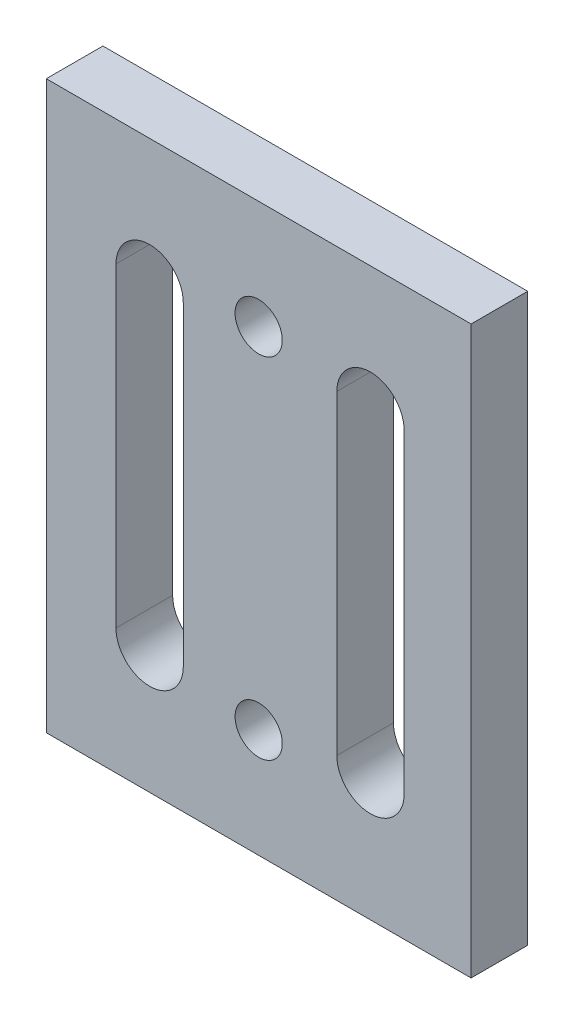
ISO-10303-21;
HEADER;
FILE_DESCRIPTION(('STEP AP214'),'2;1');
FILE_NAME('part.step','',(''),(''),'','','');
FILE_SCHEMA(('AUTOMOTIVE_DESIGN { 1 0 10303 214 1 1 1 1 }'));
ENDSEC;
DATA;
#1=APPLICATION_CONTEXT('core data for automotive mechanical design processes');
#2=APPLICATION_PROTOCOL_DEFINITION('international standard','automotive_design',2000,#1);
#3=PRODUCT_CONTEXT('',#1,'mechanical');
#4=PRODUCT('Part','Part','',(#3));
#5=PRODUCT_RELATED_PRODUCT_CATEGORY('part','',(#4));
#6=PRODUCT_DEFINITION_FORMATION('','',#4);
#7=PRODUCT_DEFINITION_CONTEXT('part definition',#1,'design');
#8=PRODUCT_DEFINITION('design','',#6,#7);
#9=PRODUCT_DEFINITION_SHAPE('','',#8);
#10=(LENGTH_UNIT() NAMED_UNIT(*) SI_UNIT(.MILLI.,.METRE.));
#11=(NAMED_UNIT(*) PLANE_ANGLE_UNIT() SI_UNIT($,.RADIAN.));
#12=(NAMED_UNIT(*) SI_UNIT($,.STERADIAN.) SOLID_ANGLE_UNIT());
#13=UNCERTAINTY_MEASURE_WITH_UNIT(LENGTH_MEASURE(1.E-05),#10,'distance_accuracy_value','');
#14=(GEOMETRIC_REPRESENTATION_CONTEXT(3) GLOBAL_UNCERTAINTY_ASSIGNED_CONTEXT((#13)) GLOBAL_UNIT_ASSIGNED_CONTEXT((#10,
#11,#12)) REPRESENTATION_CONTEXT('',''));
#15=CARTESIAN_POINT('',(0.,0.,0.));
#16=DIRECTION('',(0.,0.,1.));
#17=DIRECTION('',(1.,0.,0.));
#18=AXIS2_PLACEMENT_3D('',#15,#16,#17);
#19=CARTESIAN_POINT('',(-22.5,30.,6.));
#20=DIRECTION('',(0.,1.,0.));
#21=DIRECTION('',(0.,0.,1.));
#22=AXIS2_PLACEMENT_3D('',#19,#20,#21);
#23=PLANE('',#22);
#24=DIRECTION('',(1.,0.,0.));
#25=VECTOR('',#24,1.);
#26=CARTESIAN_POINT('',(-22.5,30.,0.));
#27=LINE('',#26,#25);
#28=CARTESIAN_POINT('',(-22.5,30.,0.));
#29=VERTEX_POINT('',#28);
#30=CARTESIAN_POINT('',(22.5,30.,0.));
#31=VERTEX_POINT('',#30);
#32=EDGE_CURVE('E204',#29,#31,#27,.T.);
#33=ORIENTED_EDGE('',*,*,#32,.F.);
#34=DIRECTION('',(0.,0.,-1.));
#35=VECTOR('',#34,1.);
#36=CARTESIAN_POINT('',(-22.5,30.,6.));
#37=LINE('',#36,#35);
#38=CARTESIAN_POINT('',(-22.5,30.,6.));
#39=VERTEX_POINT('',#38);
#40=EDGE_CURVE('E11',#39,#29,#37,.T.);
#41=ORIENTED_EDGE('',*,*,#40,.F.);
#42=DIRECTION('',(1.,0.,0.));
#43=VECTOR('',#42,1.);
#44=CARTESIAN_POINT('',(-22.5,30.,6.));
#45=LINE('',#44,#43);
#46=CARTESIAN_POINT('',(22.5,30.,6.));
#47=VERTEX_POINT('',#46);
#48=EDGE_CURVE('E207',#39,#47,#45,.T.);
#49=ORIENTED_EDGE('',*,*,#48,.T.);
#50=DIRECTION('',(0.,0.,-1.));
#51=VECTOR('',#50,1.);
#52=CARTESIAN_POINT('',(22.5,30.,6.));
#53=LINE('',#52,#51);
#54=EDGE_CURVE('E40',#47,#31,#53,.T.);
#55=ORIENTED_EDGE('',*,*,#54,.T.);
#56=EDGE_LOOP('',(#33,#41,#49,#55));
#57=FACE_BOUND('',#56,.T.);
#58=ADVANCED_FACE('F37',(#57),#23,.T.);
#59=CARTESIAN_POINT('',(-22.5,-30.,6.));
#60=DIRECTION('',(-1.,0.,0.));
#61=DIRECTION('',(0.,0.,1.));
#62=AXIS2_PLACEMENT_3D('',#59,#60,#61);
#63=PLANE('',#62);
#64=DIRECTION('',(0.,1.,0.));
#65=VECTOR('',#64,1.);
#66=CARTESIAN_POINT('',(-22.5,-30.,0.));
#67=LINE('',#66,#65);
#68=CARTESIAN_POINT('',(-22.5,-30.,0.));
#69=VERTEX_POINT('',#68);
#70=EDGE_CURVE('E211',#69,#29,#67,.T.);
#71=ORIENTED_EDGE('',*,*,#70,.F.);
#72=DIRECTION('',(0.,0.,-1.));
#73=VECTOR('',#72,1.);
#74=CARTESIAN_POINT('',(-22.5,-30.,6.));
#75=LINE('',#74,#73);
#76=CARTESIAN_POINT('',(-22.5,-30.,6.));
#77=VERTEX_POINT('',#76);
#78=EDGE_CURVE('E45',#77,#69,#75,.T.);
#79=ORIENTED_EDGE('',*,*,#78,.F.);
#80=DIRECTION('',(0.,1.,0.));
#81=VECTOR('',#80,1.);
#82=CARTESIAN_POINT('',(-22.5,-30.,6.));
#83=LINE('',#82,#81);
#84=EDGE_CURVE('E217',#77,#39,#83,.T.);
#85=ORIENTED_EDGE('',*,*,#84,.T.);
#86=ORIENTED_EDGE('',*,*,#40,.T.);
#87=EDGE_LOOP('',(#71,#79,#85,#86));
#88=FACE_BOUND('',#87,.T.);
#89=ADVANCED_FACE('F243',(#88),#63,.T.);
#90=CARTESIAN_POINT('',(22.5,-30.,6.));
#91=DIRECTION('',(0.,-1.,0.));
#92=DIRECTION('',(0.,0.,-1.));
#93=AXIS2_PLACEMENT_3D('',#90,#91,#92);
#94=PLANE('',#93);
#95=DIRECTION('',(-1.,0.,0.));
#96=VECTOR('',#95,1.);
#97=CARTESIAN_POINT('',(22.5,-30.,0.));
#98=LINE('',#97,#96);
#99=CARTESIAN_POINT('',(22.5,-30.,0.));
#100=VERTEX_POINT('',#99);
#101=EDGE_CURVE('E225',#100,#69,#98,.T.);
#102=ORIENTED_EDGE('',*,*,#101,.F.);
#103=DIRECTION('',(0.,0.,-1.));
#104=VECTOR('',#103,1.);
#105=CARTESIAN_POINT('',(22.5,-30.,6.));
#106=LINE('',#105,#104);
#107=CARTESIAN_POINT('',(22.5,-30.,6.));
#108=VERTEX_POINT('',#107);
#109=EDGE_CURVE('E230',#108,#100,#106,.T.);
#110=ORIENTED_EDGE('',*,*,#109,.F.);
#111=DIRECTION('',(-1.,0.,0.));
#112=VECTOR('',#111,1.);
#113=CARTESIAN_POINT('',(22.5,-30.,6.));
#114=LINE('',#113,#112);
#115=EDGE_CURVE('E214',#108,#77,#114,.T.);
#116=ORIENTED_EDGE('',*,*,#115,.T.);
#117=ORIENTED_EDGE('',*,*,#78,.T.);
#118=EDGE_LOOP('',(#102,#110,#116,#117));
#119=FACE_BOUND('',#118,.T.);
#120=ADVANCED_FACE('F248',(#119),#94,.T.);
#121=CARTESIAN_POINT('',(22.5,30.,6.));
#122=DIRECTION('',(1.,0.,0.));
#123=DIRECTION('',(0.,0.,-1.));
#124=AXIS2_PLACEMENT_3D('',#121,#122,#123);
#125=PLANE('',#124);
#126=DIRECTION('',(0.,-1.,0.));
#127=VECTOR('',#126,1.);
#128=CARTESIAN_POINT('',(22.5,30.,0.));
#129=LINE('',#128,#127);
#130=EDGE_CURVE('E222',#31,#100,#129,.T.);
#131=ORIENTED_EDGE('',*,*,#130,.F.);
#132=ORIENTED_EDGE('',*,*,#54,.F.);
#133=DIRECTION('',(0.,-1.,0.));
#134=VECTOR('',#133,1.);
#135=CARTESIAN_POINT('',(22.5,30.,6.));
#136=LINE('',#135,#134);
#137=EDGE_CURVE('E210',#47,#108,#136,.T.);
#138=ORIENTED_EDGE('',*,*,#137,.T.);
#139=ORIENTED_EDGE('',*,*,#109,.T.);
#140=EDGE_LOOP('',(#131,#132,#138,#139));
#141=FACE_BOUND('',#140,.T.);
#142=ADVANCED_FACE('F238',(#141),#125,.T.);
#143=CARTESIAN_POINT('',(0.,0.,6.));
#144=DIRECTION('',(0.,0.,-1.));
#145=DIRECTION('',(-1.,0.,0.));
#146=AXIS2_PLACEMENT_3D('',#143,#144,#145);
#147=PLANE('',#146);
#148=DIRECTION('',(0.,1.,0.));
#149=VECTOR('',#148,1.);
#150=CARTESIAN_POINT('',(-15.1153246739558,16.7000000000324,6.));
#151=LINE('',#150,#149);
#152=CARTESIAN_POINT('',(-15.1153246739558,-16.7,6.));
#153=VERTEX_POINT('',#152);
#154=CARTESIAN_POINT('',(-15.1153246739558,16.7000000000324,6.));
#155=VERTEX_POINT('',#154);
#156=EDGE_CURVE('E134',#153,#155,#151,.T.);
#157=ORIENTED_EDGE('',*,*,#156,.T.);
#158=CARTESIAN_POINT('',(-11.5513733386219,16.7000000000324,6.));
#159=DIRECTION('',(0.,0.,-1.));
#160=DIRECTION('',(1.,0.,0.));
#161=AXIS2_PLACEMENT_3D('',#158,#159,#160);
#162=CIRCLE('',#161,3.56395133533396);
#163=CARTESIAN_POINT('',(-7.98742200328791,16.7000000000324,6.));
#164=VERTEX_POINT('',#163);
#165=EDGE_CURVE('E128',#155,#164,#162,.T.);
#166=ORIENTED_EDGE('',*,*,#165,.T.);
#167=DIRECTION('',(0.,-1.,0.));
#168=VECTOR('',#167,1.);
#169=CARTESIAN_POINT('',(-7.98742200328791,16.7000000000324,6.));
#170=LINE('',#169,#168);
#171=CARTESIAN_POINT('',(-7.98742200328791,-16.7,6.));
#172=VERTEX_POINT('',#171);
#173=EDGE_CURVE('E137',#164,#172,#170,.T.);
#174=ORIENTED_EDGE('',*,*,#173,.T.);
#175=CARTESIAN_POINT('',(-11.5513733386219,-16.7,6.));
#176=DIRECTION('',(0.,0.,-1.));
#177=DIRECTION('',(1.,0.,0.));
#178=AXIS2_PLACEMENT_3D('',#175,#176,#177);
#179=CIRCLE('',#178,3.56395133533396);
#180=EDGE_CURVE('E53',#172,#153,#179,.T.);
#181=ORIENTED_EDGE('',*,*,#180,.T.);
#182=EDGE_LOOP('',(#157,#166,#174,#181));
#183=FACE_BOUND('',#182,.T.);
#184=DIRECTION('',(0.,1.,0.));
#185=VECTOR('',#184,1.);
#186=CARTESIAN_POINT('',(8.27728020128726,16.7000000000324,6.));
#187=LINE('',#186,#185);
#188=CARTESIAN_POINT('',(8.27728020128726,-16.7,6.));
#189=VERTEX_POINT('',#188);
#190=CARTESIAN_POINT('',(8.27728020128726,16.7000000000324,6.));
#191=VERTEX_POINT('',#190);
#192=EDGE_CURVE('E173',#189,#191,#187,.T.);
#193=ORIENTED_EDGE('',*,*,#192,.T.);
#194=CARTESIAN_POINT('',(11.8412315366212,16.7000000000324,6.));
#195=DIRECTION('',(0.,0.,-1.));
#196=DIRECTION('',(-1.,0.,0.));
#197=AXIS2_PLACEMENT_3D('',#194,#195,#196);
#198=CIRCLE('',#197,3.56395133533396);
#199=CARTESIAN_POINT('',(15.4051828719552,16.7000000000324,6.));
#200=VERTEX_POINT('',#199);
#201=EDGE_CURVE('E163',#191,#200,#198,.T.);
#202=ORIENTED_EDGE('',*,*,#201,.T.);
#203=DIRECTION('',(0.,-1.,0.));
#204=VECTOR('',#203,1.);
#205=CARTESIAN_POINT('',(15.4051828719552,16.7000000000324,6.));
#206=LINE('',#205,#204);
#207=CARTESIAN_POINT('',(15.4051828719552,-16.7,6.));
#208=VERTEX_POINT('',#207);
#209=EDGE_CURVE('E166',#200,#208,#206,.T.);
#210=ORIENTED_EDGE('',*,*,#209,.T.);
#211=CARTESIAN_POINT('',(11.8412315366212,-16.7,6.));
#212=DIRECTION('',(0.,0.,-1.));
#213=DIRECTION('',(-1.,0.,0.));
#214=AXIS2_PLACEMENT_3D('',#211,#212,#213);
#215=CIRCLE('',#214,3.56395133533396);
#216=EDGE_CURVE('E170',#208,#189,#215,.T.);
#217=ORIENTED_EDGE('',*,*,#216,.T.);
#218=EDGE_LOOP('',(#193,#202,#210,#217));
#219=FACE_BOUND('',#218,.T.);
#220=CARTESIAN_POINT('',(0.,-18.5,6.));
#221=DIRECTION('',(0.,0.,-1.));
#222=DIRECTION('',(-1.,0.,0.));
#223=AXIS2_PLACEMENT_3D('',#220,#221,#222);
#224=CIRCLE('',#223,2.5);
#225=CARTESIAN_POINT('',(-2.49999999999999,-18.5,6.));
#226=VERTEX_POINT('',#225);
#227=EDGE_CURVE('E195',#226,#226,#224,.T.);
#228=ORIENTED_EDGE('',*,*,#227,.T.);
#229=EDGE_LOOP('',(#228));
#230=FACE_BOUND('',#229,.T.);
#231=CARTESIAN_POINT('',(0.,18.5,6.));
#232=DIRECTION('',(0.,0.,-1.));
#233=DIRECTION('',(-1.,0.,0.));
#234=AXIS2_PLACEMENT_3D('',#231,#232,#233);
#235=CIRCLE('',#234,2.5);
#236=CARTESIAN_POINT('',(-2.50000000000001,18.5,6.));
#237=VERTEX_POINT('',#236);
#238=EDGE_CURVE('E201',#237,#237,#235,.T.);
#239=ORIENTED_EDGE('',*,*,#238,.T.);
#240=EDGE_LOOP('',(#239));
#241=FACE_BOUND('',#240,.T.);
#242=ORIENTED_EDGE('',*,*,#48,.F.);
#243=ORIENTED_EDGE('',*,*,#84,.F.);
#244=ORIENTED_EDGE('',*,*,#115,.F.);
#245=ORIENTED_EDGE('',*,*,#137,.F.);
#246=EDGE_LOOP('',(#242,#243,#244,#245));
#247=FACE_BOUND('',#246,.T.);
#248=ADVANCED_FACE('F141',(#183,#219,#230,#241,#247),#147,.F.);
#249=CARTESIAN_POINT('',(0.,0.,0.));
#250=DIRECTION('',(0.,0.,-1.));
#251=DIRECTION('',(-1.,0.,0.));
#252=AXIS2_PLACEMENT_3D('',#249,#250,#251);
#253=PLANE('',#252);
#254=CARTESIAN_POINT('',(-11.5513733386219,16.7000000000324,0.));
#255=DIRECTION('',(0.,0.,-1.));
#256=DIRECTION('',(1.,0.,0.));
#257=AXIS2_PLACEMENT_3D('',#254,#255,#256);
#258=CIRCLE('',#257,3.56395133533396);
#259=CARTESIAN_POINT('',(-15.1153246739558,16.7000000000324,0.));
#260=VERTEX_POINT('',#259);
#261=CARTESIAN_POINT('',(-7.98742200328791,16.7000000000324,0.));
#262=VERTEX_POINT('',#261);
#263=EDGE_CURVE('E61',#260,#262,#258,.T.);
#264=ORIENTED_EDGE('',*,*,#263,.F.);
#265=DIRECTION('',(0.,1.,0.));
#266=VECTOR('',#265,1.);
#267=CARTESIAN_POINT('',(-15.1153246739558,16.7000000000324,0.));
#268=LINE('',#267,#266);
#269=CARTESIAN_POINT('',(-15.1153246739558,-16.7,0.));
#270=VERTEX_POINT('',#269);
#271=EDGE_CURVE('E144',#270,#260,#268,.T.);
#272=ORIENTED_EDGE('',*,*,#271,.F.);
#273=CARTESIAN_POINT('',(-11.5513733386219,-16.7,0.));
#274=DIRECTION('',(0.,0.,-1.));
#275=DIRECTION('',(1.,0.,0.));
#276=AXIS2_PLACEMENT_3D('',#273,#274,#275);
#277=CIRCLE('',#276,3.56395133533396);
#278=CARTESIAN_POINT('',(-7.98742200328791,-16.7,0.));
#279=VERTEX_POINT('',#278);
#280=EDGE_CURVE('E147',#279,#270,#277,.T.);
#281=ORIENTED_EDGE('',*,*,#280,.F.);
#282=DIRECTION('',(0.,-1.,0.));
#283=VECTOR('',#282,1.);
#284=CARTESIAN_POINT('',(-7.98742200328791,16.7000000000324,0.));
#285=LINE('',#284,#283);
#286=EDGE_CURVE('E153',#262,#279,#285,.T.);
#287=ORIENTED_EDGE('',*,*,#286,.F.);
#288=EDGE_LOOP('',(#264,#272,#281,#287));
#289=FACE_BOUND('',#288,.T.);
#290=CARTESIAN_POINT('',(11.8412315366212,16.7000000000324,0.));
#291=DIRECTION('',(0.,0.,-1.));
#292=DIRECTION('',(-1.,0.,0.));
#293=AXIS2_PLACEMENT_3D('',#290,#291,#292);
#294=CIRCLE('',#293,3.56395133533396);
#295=CARTESIAN_POINT('',(8.27728020128726,16.7000000000324,0.));
#296=VERTEX_POINT('',#295);
#297=CARTESIAN_POINT('',(15.4051828719552,16.7000000000324,0.));
#298=VERTEX_POINT('',#297);
#299=EDGE_CURVE('E159',#296,#298,#294,.T.);
#300=ORIENTED_EDGE('',*,*,#299,.F.);
#301=DIRECTION('',(0.,1.,0.));
#302=VECTOR('',#301,1.);
#303=CARTESIAN_POINT('',(8.27728020128726,16.7000000000324,0.));
#304=LINE('',#303,#302);
#305=CARTESIAN_POINT('',(8.27728020128726,-16.7,0.));
#306=VERTEX_POINT('',#305);
#307=EDGE_CURVE('E167',#306,#296,#304,.T.);
#308=ORIENTED_EDGE('',*,*,#307,.F.);
#309=CARTESIAN_POINT('',(11.8412315366212,-16.7,0.));
#310=DIRECTION('',(0.,0.,-1.));
#311=DIRECTION('',(-1.,0.,0.));
#312=AXIS2_PLACEMENT_3D('',#309,#310,#311);
#313=CIRCLE('',#312,3.56395133533396);
#314=CARTESIAN_POINT('',(15.4051828719552,-16.7,0.));
#315=VERTEX_POINT('',#314);
#316=EDGE_CURVE('E181',#315,#306,#313,.T.);
#317=ORIENTED_EDGE('',*,*,#316,.F.);
#318=DIRECTION('',(0.,-1.,0.));
#319=VECTOR('',#318,1.);
#320=CARTESIAN_POINT('',(15.4051828719552,16.7000000000324,0.));
#321=LINE('',#320,#319);
#322=EDGE_CURVE('E178',#298,#315,#321,.T.);
#323=ORIENTED_EDGE('',*,*,#322,.F.);
#324=EDGE_LOOP('',(#300,#308,#317,#323));
#325=FACE_BOUND('',#324,.T.);
#326=CARTESIAN_POINT('',(0.,-18.5,0.));
#327=DIRECTION('',(0.,0.,-1.));
#328=DIRECTION('',(-1.,0.,0.));
#329=AXIS2_PLACEMENT_3D('',#326,#327,#328);
#330=CIRCLE('',#329,2.5);
#331=CARTESIAN_POINT('',(-2.49999999999999,-18.5,0.));
#332=VERTEX_POINT('',#331);
#333=EDGE_CURVE('E188',#332,#332,#330,.T.);
#334=ORIENTED_EDGE('',*,*,#333,.F.);
#335=EDGE_LOOP('',(#334));
#336=FACE_BOUND('',#335,.T.);
#337=CARTESIAN_POINT('',(0.,18.5,0.));
#338=DIRECTION('',(0.,0.,-1.));
#339=DIRECTION('',(-1.,0.,0.));
#340=AXIS2_PLACEMENT_3D('',#337,#338,#339);
#341=CIRCLE('',#340,2.5);
#342=CARTESIAN_POINT('',(-2.50000000000001,18.5,0.));
#343=VERTEX_POINT('',#342);
#344=EDGE_CURVE('E198',#343,#343,#341,.T.);
#345=ORIENTED_EDGE('',*,*,#344,.F.);
#346=EDGE_LOOP('',(#345));
#347=FACE_BOUND('',#346,.T.);
#348=ORIENTED_EDGE('',*,*,#32,.T.);
#349=ORIENTED_EDGE('',*,*,#130,.T.);
#350=ORIENTED_EDGE('',*,*,#101,.T.);
#351=ORIENTED_EDGE('',*,*,#70,.T.);
#352=EDGE_LOOP('',(#348,#349,#350,#351));
#353=FACE_BOUND('',#352,.T.);
#354=ADVANCED_FACE('F240',(#289,#325,#336,#347,#353),#253,.T.);
#355=CARTESIAN_POINT('',(0.,18.5,6.));
#356=DIRECTION('',(0.,0.,-1.));
#357=DIRECTION('',(-1.,0.,0.));
#358=AXIS2_PLACEMENT_3D('',#355,#356,#357);
#359=CYLINDRICAL_SURFACE('',#358,2.5);
#360=ORIENTED_EDGE('',*,*,#238,.F.);
#361=EDGE_LOOP('',(#360));
#362=FACE_BOUND('',#361,.T.);
#363=ORIENTED_EDGE('',*,*,#344,.T.);
#364=EDGE_LOOP('',(#363));
#365=FACE_BOUND('',#364,.T.);
#366=ADVANCED_FACE('F290',(#362,#365),#359,.F.);
#367=CARTESIAN_POINT('',(0.,-18.5,6.));
#368=DIRECTION('',(0.,0.,-1.));
#369=DIRECTION('',(-1.,0.,0.));
#370=AXIS2_PLACEMENT_3D('',#367,#368,#369);
#371=CYLINDRICAL_SURFACE('',#370,2.5);
#372=ORIENTED_EDGE('',*,*,#227,.F.);
#373=EDGE_LOOP('',(#372));
#374=FACE_BOUND('',#373,.T.);
#375=ORIENTED_EDGE('',*,*,#333,.T.);
#376=EDGE_LOOP('',(#375));
#377=FACE_BOUND('',#376,.T.);
#378=ADVANCED_FACE('F300',(#374,#377),#371,.F.);
#379=CARTESIAN_POINT('',(11.8412315366212,16.7000000000324,6.));
#380=DIRECTION('',(0.,0.,-1.));
#381=DIRECTION('',(-1.,0.,0.));
#382=AXIS2_PLACEMENT_3D('',#379,#380,#381);
#383=CYLINDRICAL_SURFACE('',#382,3.56395133533396);
#384=ORIENTED_EDGE('',*,*,#299,.T.);
#385=DIRECTION('',(0.,0.,-1.));
#386=VECTOR('',#385,1.);
#387=CARTESIAN_POINT('',(15.4051828719552,16.7000000000324,6.));
#388=LINE('',#387,#386);
#389=EDGE_CURVE('E176',#200,#298,#388,.T.);
#390=ORIENTED_EDGE('',*,*,#389,.F.);
#391=ORIENTED_EDGE('',*,*,#201,.F.);
#392=DIRECTION('',(0.,0.,-1.));
#393=VECTOR('',#392,1.);
#394=CARTESIAN_POINT('',(8.27728020128726,16.7000000000324,6.));
#395=LINE('',#394,#393);
#396=EDGE_CURVE('E186',#191,#296,#395,.T.);
#397=ORIENTED_EDGE('',*,*,#396,.T.);
#398=EDGE_LOOP('',(#384,#390,#391,#397));
#399=FACE_BOUND('',#398,.T.);
#400=ADVANCED_FACE('F310',(#399),#383,.F.);
#401=CARTESIAN_POINT('',(8.27728020128726,16.7000000000324,6.));
#402=DIRECTION('',(-1.,0.,0.));
#403=DIRECTION('',(0.,0.,1.));
#404=AXIS2_PLACEMENT_3D('',#401,#402,#403);
#405=PLANE('',#404);
#406=ORIENTED_EDGE('',*,*,#307,.T.);
#407=ORIENTED_EDGE('',*,*,#396,.F.);
#408=ORIENTED_EDGE('',*,*,#192,.F.);
#409=DIRECTION('',(0.,0.,-1.));
#410=VECTOR('',#409,1.);
#411=CARTESIAN_POINT('',(8.27728020128726,-16.7,6.));
#412=LINE('',#411,#410);
#413=EDGE_CURVE('E189',#189,#306,#412,.T.);
#414=ORIENTED_EDGE('',*,*,#413,.T.);
#415=EDGE_LOOP('',(#406,#407,#408,#414));
#416=FACE_BOUND('',#415,.T.);
#417=ADVANCED_FACE('F320',(#416),#405,.F.);
#418=CARTESIAN_POINT('',(11.8412315366212,-16.7,6.));
#419=DIRECTION('',(0.,0.,-1.));
#420=DIRECTION('',(-1.,0.,0.));
#421=AXIS2_PLACEMENT_3D('',#418,#419,#420);
#422=CYLINDRICAL_SURFACE('',#421,3.56395133533396);
#423=ORIENTED_EDGE('',*,*,#316,.T.);
#424=ORIENTED_EDGE('',*,*,#413,.F.);
#425=ORIENTED_EDGE('',*,*,#216,.F.);
#426=DIRECTION('',(0.,0.,-1.));
#427=VECTOR('',#426,1.);
#428=CARTESIAN_POINT('',(15.4051828719552,-16.7,6.));
#429=LINE('',#428,#427);
#430=EDGE_CURVE('E191',#208,#315,#429,.T.);
#431=ORIENTED_EDGE('',*,*,#430,.T.);
#432=EDGE_LOOP('',(#423,#424,#425,#431));
#433=FACE_BOUND('',#432,.T.);
#434=ADVANCED_FACE('F330',(#433),#422,.F.);
#435=CARTESIAN_POINT('',(15.4051828719552,16.7000000000324,6.));
#436=DIRECTION('',(1.,0.,0.));
#437=DIRECTION('',(0.,0.,-1.));
#438=AXIS2_PLACEMENT_3D('',#435,#436,#437);
#439=PLANE('',#438);
#440=ORIENTED_EDGE('',*,*,#322,.T.);
#441=ORIENTED_EDGE('',*,*,#430,.F.);
#442=ORIENTED_EDGE('',*,*,#209,.F.);
#443=ORIENTED_EDGE('',*,*,#389,.T.);
#444=EDGE_LOOP('',(#440,#441,#442,#443));
#445=FACE_BOUND('',#444,.T.);
#446=ADVANCED_FACE('F340',(#445),#439,.F.);
#447=CARTESIAN_POINT('',(-11.5513733386219,16.7000000000324,6.));
#448=DIRECTION('',(0.,0.,-1.));
#449=DIRECTION('',(-1.,0.,0.));
#450=AXIS2_PLACEMENT_3D('',#447,#448,#449);
#451=CYLINDRICAL_SURFACE('',#450,3.56395133533396);
#452=ORIENTED_EDGE('',*,*,#263,.T.);
#453=DIRECTION('',(0.,0.,-1.));
#454=VECTOR('',#453,1.);
#455=CARTESIAN_POINT('',(-7.98742200328791,16.7000000000324,6.));
#456=LINE('',#455,#454);
#457=EDGE_CURVE('E124',#164,#262,#456,.T.);
#458=ORIENTED_EDGE('',*,*,#457,.F.);
#459=ORIENTED_EDGE('',*,*,#165,.F.);
#460=DIRECTION('',(0.,0.,-1.));
#461=VECTOR('',#460,1.);
#462=CARTESIAN_POINT('',(-15.1153246739558,16.7000000000324,6.));
#463=LINE('',#462,#461);
#464=EDGE_CURVE('E157',#155,#260,#463,.T.);
#465=ORIENTED_EDGE('',*,*,#464,.T.);
#466=EDGE_LOOP('',(#452,#458,#459,#465));
#467=FACE_BOUND('',#466,.T.);
#468=ADVANCED_FACE('F126',(#467),#451,.F.);
#469=CARTESIAN_POINT('',(-15.1153246739558,16.7000000000324,6.));
#470=DIRECTION('',(-1.,0.,0.));
#471=DIRECTION('',(0.,0.,1.));
#472=AXIS2_PLACEMENT_3D('',#469,#470,#471);
#473=PLANE('',#472);
#474=ORIENTED_EDGE('',*,*,#271,.T.);
#475=ORIENTED_EDGE('',*,*,#464,.F.);
#476=ORIENTED_EDGE('',*,*,#156,.F.);
#477=DIRECTION('',(0.,0.,-1.));
#478=VECTOR('',#477,1.);
#479=CARTESIAN_POINT('',(-15.1153246739558,-16.7,6.));
#480=LINE('',#479,#478);
#481=EDGE_CURVE('E160',#153,#270,#480,.T.);
#482=ORIENTED_EDGE('',*,*,#481,.T.);
#483=EDGE_LOOP('',(#474,#475,#476,#482));
#484=FACE_BOUND('',#483,.T.);
#485=ADVANCED_FACE('F359',(#484),#473,.F.);
#486=CARTESIAN_POINT('',(-11.5513733386219,-16.7,6.));
#487=DIRECTION('',(0.,0.,-1.));
#488=DIRECTION('',(-1.,0.,0.));
#489=AXIS2_PLACEMENT_3D('',#486,#487,#488);
#490=CYLINDRICAL_SURFACE('',#489,3.56395133533396);
#491=ORIENTED_EDGE('',*,*,#280,.T.);
#492=ORIENTED_EDGE('',*,*,#481,.F.);
#493=ORIENTED_EDGE('',*,*,#180,.F.);
#494=DIRECTION('',(0.,0.,-1.));
#495=VECTOR('',#494,1.);
#496=CARTESIAN_POINT('',(-7.98742200328791,-16.7,6.));
#497=LINE('',#496,#495);
#498=EDGE_CURVE('E133',#172,#279,#497,.T.);
#499=ORIENTED_EDGE('',*,*,#498,.T.);
#500=EDGE_LOOP('',(#491,#492,#493,#499));
#501=FACE_BOUND('',#500,.T.);
#502=ADVANCED_FACE('F368',(#501),#490,.F.);
#503=CARTESIAN_POINT('',(-7.98742200328791,16.7000000000324,6.));
#504=DIRECTION('',(1.,0.,0.));
#505=DIRECTION('',(0.,0.,-1.));
#506=AXIS2_PLACEMENT_3D('',#503,#504,#505);
#507=PLANE('',#506);
#508=ORIENTED_EDGE('',*,*,#286,.T.);
#509=ORIENTED_EDGE('',*,*,#498,.F.);
#510=ORIENTED_EDGE('',*,*,#173,.F.);
#511=ORIENTED_EDGE('',*,*,#457,.T.);
#512=EDGE_LOOP('',(#508,#509,#510,#511));
#513=FACE_BOUND('',#512,.T.);
#514=ADVANCED_FACE('F138',(#513),#507,.F.);
#515=CLOSED_SHELL('',(#58,#89,#120,#142,#248,#354,#366,#378,#400,#417,#434,#446,#468,#485,#502,#514));
#516=MANIFOLD_SOLID_BREP('B2',#515);
#517=ADVANCED_BREP_SHAPE_REPRESENTATION('',(#18,#516),#14);
#518=SHAPE_DEFINITION_REPRESENTATION(#9,#517);
ENDSEC;
END-ISO-10303-21;
